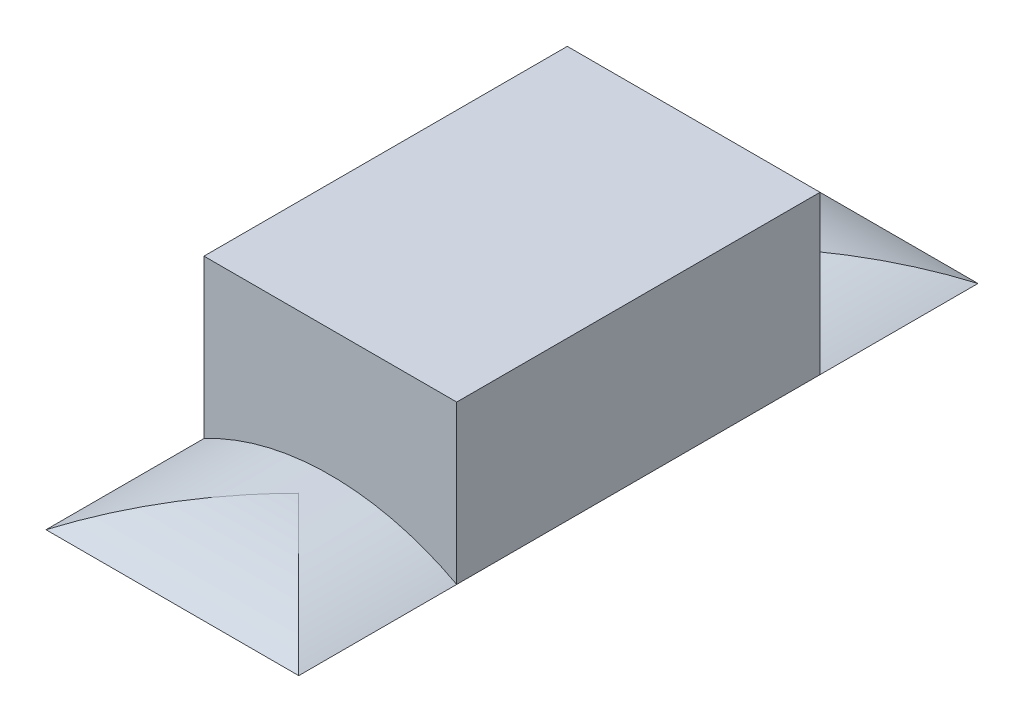
ISO-10303-21;
HEADER;
FILE_DESCRIPTION(('STEP AP214'),'2;1');
FILE_NAME('part.step','',(''),(''),'','','');
FILE_SCHEMA(('AUTOMOTIVE_DESIGN { 1 0 10303 214 1 1 1 1 }'));
ENDSEC;
DATA;
#1=APPLICATION_CONTEXT('core data for automotive mechanical design processes');
#2=APPLICATION_PROTOCOL_DEFINITION('international standard','automotive_design',2000,#1);
#3=PRODUCT_CONTEXT('',#1,'mechanical');
#4=PRODUCT('Part','Part','',(#3));
#5=PRODUCT_RELATED_PRODUCT_CATEGORY('part','',(#4));
#6=PRODUCT_DEFINITION_FORMATION('','',#4);
#7=PRODUCT_DEFINITION_CONTEXT('part definition',#1,'design');
#8=PRODUCT_DEFINITION('design','',#6,#7);
#9=PRODUCT_DEFINITION_SHAPE('','',#8);
#10=(LENGTH_UNIT() NAMED_UNIT(*) SI_UNIT(.MILLI.,.METRE.));
#11=(NAMED_UNIT(*) PLANE_ANGLE_UNIT() SI_UNIT($,.RADIAN.));
#12=(NAMED_UNIT(*) SI_UNIT($,.STERADIAN.) SOLID_ANGLE_UNIT());
#13=UNCERTAINTY_MEASURE_WITH_UNIT(LENGTH_MEASURE(1.E-05),#10,'distance_accuracy_value','');
#14=(GEOMETRIC_REPRESENTATION_CONTEXT(3) GLOBAL_UNCERTAINTY_ASSIGNED_CONTEXT((#13)) GLOBAL_UNIT_ASSIGNED_CONTEXT((#10,
#11,#12)) REPRESENTATION_CONTEXT('',''));
#15=CARTESIAN_POINT('',(0.,0.,0.));
#16=DIRECTION('',(0.,0.,1.));
#17=DIRECTION('',(1.,0.,0.));
#18=AXIS2_PLACEMENT_3D('',#15,#16,#17);
#19=CARTESIAN_POINT('',(15.8,0.,33.85));
#20=DIRECTION('',(0.,1.,0.));
#21=DIRECTION('',(0.,0.,1.));
#22=AXIS2_PLACEMENT_3D('',#19,#20,#21);
#23=PLANE('',#22);
#24=DIRECTION('',(1.,0.,0.));
#25=VECTOR('',#24,1.);
#26=CARTESIAN_POINT('',(15.8,0.,35.));
#27=LINE('',#26,#25);
#28=CARTESIAN_POINT('',(15.,0.,35.));
#29=VERTEX_POINT('',#28);
#30=CARTESIAN_POINT('',(16.6,0.,35.));
#31=VERTEX_POINT('',#30);
#32=EDGE_CURVE('P0_E19',#29,#31,#27,.T.);
#33=ORIENTED_EDGE('',*,*,#32,.F.);
#34=DIRECTION('',(0.,0.,1.));
#35=VECTOR('',#34,1.);
#36=CARTESIAN_POINT('',(15.,0.,32.7));
#37=LINE('',#36,#35);
#38=CARTESIAN_POINT('',(15.,0.,32.7));
#39=VERTEX_POINT('',#38);
#40=EDGE_CURVE('P0_E54',#39,#29,#37,.T.);
#41=ORIENTED_EDGE('',*,*,#40,.F.);
#42=DIRECTION('',(-1.,0.,0.));
#43=VECTOR('',#42,1.);
#44=CARTESIAN_POINT('',(16.6,0.,32.7));
#45=LINE('',#44,#43);
#46=CARTESIAN_POINT('',(16.6,0.,32.7));
#47=VERTEX_POINT('',#46);
#48=EDGE_CURVE('P0_E57',#47,#39,#45,.T.);
#49=ORIENTED_EDGE('',*,*,#48,.F.);
#50=DIRECTION('',(0.,0.,-1.));
#51=VECTOR('',#50,1.);
#52=CARTESIAN_POINT('',(16.6,0.,35.));
#53=LINE('',#52,#51);
#54=EDGE_CURVE('P0_E59',#31,#47,#53,.T.);
#55=ORIENTED_EDGE('',*,*,#54,.F.);
#56=EDGE_LOOP('',(#33,#41,#49,#55));
#57=FACE_BOUND('',#56,.T.);
#58=ADVANCED_FACE('P0_F16',(#57),#23,.F.);
#59=CARTESIAN_POINT('',(16.6,0.,35.));
#60=DIRECTION('',(1.,0.,0.));
#61=DIRECTION('',(0.,0.,-1.));
#62=AXIS2_PLACEMENT_3D('',#59,#60,#61);
#63=PLANE('',#62);
#64=DIRECTION('',(0.,0.,1.));
#65=VECTOR('',#64,1.);
#66=CARTESIAN_POINT('',(16.6,1.,33.85));
#67=LINE('',#66,#65);
#68=CARTESIAN_POINT('',(16.6,1.,35.));
#69=VERTEX_POINT('',#68);
#70=CARTESIAN_POINT('',(16.6,1.,32.7));
#71=VERTEX_POINT('',#70);
#72=EDGE_CURVE('P0_E82',#69,#71,#67,.F.);
#73=ORIENTED_EDGE('',*,*,#72,.F.);
#74=DIRECTION('',(0.,1.,0.));
#75=VECTOR('',#74,1.);
#76=CARTESIAN_POINT('',(16.6,0.,35.));
#77=LINE('',#76,#75);
#78=EDGE_CURVE('P0_E70',#31,#69,#77,.T.);
#79=ORIENTED_EDGE('',*,*,#78,.F.);
#80=ORIENTED_EDGE('',*,*,#54,.T.);
#81=DIRECTION('',(0.,1.,0.));
#82=VECTOR('',#81,1.);
#83=CARTESIAN_POINT('',(16.6,0.,32.7));
#84=LINE('',#83,#82);
#85=EDGE_CURVE('P0_E64',#71,#47,#84,.F.);
#86=ORIENTED_EDGE('',*,*,#85,.F.);
#87=EDGE_LOOP('',(#73,#79,#80,#86));
#88=FACE_BOUND('',#87,.T.);
#89=ADVANCED_FACE('P0_F67',(#88),#63,.T.);
#90=CARTESIAN_POINT('',(16.6,0.,32.7));
#91=DIRECTION('',(0.,0.,-1.));
#92=DIRECTION('',(-1.,0.,0.));
#93=AXIS2_PLACEMENT_3D('',#90,#91,#92);
#94=PLANE('',#93);
#95=DIRECTION('',(1.,0.,0.));
#96=VECTOR('',#95,1.);
#97=CARTESIAN_POINT('',(15.8,1.,32.7));
#98=LINE('',#97,#96);
#99=CARTESIAN_POINT('',(15.,1.,32.7));
#100=VERTEX_POINT('',#99);
#101=EDGE_CURVE('P0_E73',#71,#100,#98,.F.);
#102=ORIENTED_EDGE('',*,*,#101,.F.);
#103=ORIENTED_EDGE('',*,*,#85,.T.);
#104=ORIENTED_EDGE('',*,*,#48,.T.);
#105=DIRECTION('',(0.,1.,0.));
#106=VECTOR('',#105,1.);
#107=CARTESIAN_POINT('',(15.,0.,32.7));
#108=LINE('',#107,#106);
#109=EDGE_CURVE('P0_E76',#100,#39,#108,.F.);
#110=ORIENTED_EDGE('',*,*,#109,.F.);
#111=EDGE_LOOP('',(#102,#103,#104,#110));
#112=FACE_BOUND('',#111,.T.);
#113=ADVANCED_FACE('P0_F71',(#112),#94,.T.);
#114=CARTESIAN_POINT('',(15.,0.,32.7));
#115=DIRECTION('',(-1.,0.,0.));
#116=DIRECTION('',(0.,0.,1.));
#117=AXIS2_PLACEMENT_3D('',#114,#115,#116);
#118=PLANE('',#117);
#119=DIRECTION('',(0.,0.,1.));
#120=VECTOR('',#119,1.);
#121=CARTESIAN_POINT('',(15.,1.,33.85));
#122=LINE('',#121,#120);
#123=CARTESIAN_POINT('',(15.,1.,35.));
#124=VERTEX_POINT('',#123);
#125=EDGE_CURVE('P0_E25',#100,#124,#122,.T.);
#126=ORIENTED_EDGE('',*,*,#125,.F.);
#127=ORIENTED_EDGE('',*,*,#109,.T.);
#128=ORIENTED_EDGE('',*,*,#40,.T.);
#129=DIRECTION('',(0.,1.,0.));
#130=VECTOR('',#129,1.);
#131=CARTESIAN_POINT('',(15.,0.,35.));
#132=LINE('',#131,#130);
#133=EDGE_CURVE('P0_E34',#124,#29,#132,.F.);
#134=ORIENTED_EDGE('',*,*,#133,.F.);
#135=EDGE_LOOP('',(#126,#127,#128,#134));
#136=FACE_BOUND('',#135,.T.);
#137=ADVANCED_FACE('P0_F88',(#136),#118,.T.);
#138=CARTESIAN_POINT('',(15.,0.,35.));
#139=DIRECTION('',(0.,0.,1.));
#140=DIRECTION('',(1.,0.,0.));
#141=AXIS2_PLACEMENT_3D('',#138,#139,#140);
#142=PLANE('',#141);
#143=DIRECTION('',(1.,0.,0.));
#144=VECTOR('',#143,1.);
#145=CARTESIAN_POINT('',(15.8,1.,35.));
#146=LINE('',#145,#144);
#147=EDGE_CURVE('P0_E11',#124,#69,#146,.T.);
#148=ORIENTED_EDGE('',*,*,#147,.F.);
#149=ORIENTED_EDGE('',*,*,#133,.T.);
#150=ORIENTED_EDGE('',*,*,#32,.T.);
#151=ORIENTED_EDGE('',*,*,#78,.T.);
#152=EDGE_LOOP('',(#148,#149,#150,#151));
#153=FACE_BOUND('',#152,.T.);
#154=ADVANCED_FACE('P0_F90',(#153),#142,.T.);
#155=CARTESIAN_POINT('',(15.8,1.,33.85));
#156=DIRECTION('',(0.,1.,0.));
#157=DIRECTION('',(0.,0.,1.));
#158=AXIS2_PLACEMENT_3D('',#155,#156,#157);
#159=PLANE('',#158);
#160=ORIENTED_EDGE('',*,*,#125,.T.);
#161=ORIENTED_EDGE('',*,*,#147,.T.);
#162=ORIENTED_EDGE('',*,*,#72,.T.);
#163=ORIENTED_EDGE('',*,*,#101,.T.);
#164=EDGE_LOOP('',(#160,#161,#162,#163));
#165=FACE_BOUND('',#164,.T.);
#166=ADVANCED_FACE('P0_F87',(#165),#159,.T.);
#167=CLOSED_SHELL('',(#58,#89,#113,#137,#154,#166));
#168=MANIFOLD_SOLID_BREP('P0_B1',#167);
#169=CARTESIAN_POINT('',(15.,-1.5,32.5));
#170=DIRECTION('',(1.,0.,0.));
#171=DIRECTION('',(0.,0.,-1.));
#172=AXIS2_PLACEMENT_3D('',#169,#170,#171);
#173=CYLINDRICAL_SURFACE('',#172,1.7);
#174=CARTESIAN_POINT('',(15.8,-1.5,32.5));
#175=DIRECTION('',(0.707106781186547,0.,0.707106781186547));
#176=DIRECTION('',(-0.707106781186547,0.,0.707106781186547));
#177=AXIS2_PLACEMENT_3D('',#174,#175,#176);
#178=ELLIPSE('',#177,2.40416305603426,1.7);
#179=CARTESIAN_POINT('',(16.6,0.,31.7));
#180=VERTEX_POINT('',#179);
#181=CARTESIAN_POINT('',(15.8,0.2,32.5));
#182=VERTEX_POINT('',#181);
#183=EDGE_CURVE('P1_E19',#180,#182,#178,.T.);
#184=ORIENTED_EDGE('',*,*,#183,.F.);
#185=DIRECTION('',(1.,0.,0.));
#186=VECTOR('',#185,1.);
#187=CARTESIAN_POINT('',(15.8,0.,31.7));
#188=LINE('',#187,#186);
#189=CARTESIAN_POINT('',(15.,0.,31.7));
#190=VERTEX_POINT('',#189);
#191=EDGE_CURVE('P1_E44',#180,#190,#188,.F.);
#192=ORIENTED_EDGE('',*,*,#191,.T.);
#193=CARTESIAN_POINT('',(15.8,-1.5,32.5));
#194=DIRECTION('',(-0.707106781186547,0.,0.707106781186547));
#195=DIRECTION('',(0.707106781186547,0.,0.707106781186547));
#196=AXIS2_PLACEMENT_3D('',#193,#194,#195);
#197=ELLIPSE('',#196,2.40416305603426,1.7);
#198=EDGE_CURVE('P1_E49',#182,#190,#197,.T.);
#199=ORIENTED_EDGE('',*,*,#198,.F.);
#200=EDGE_LOOP('',(#184,#192,#199));
#201=FACE_BOUND('',#200,.T.);
#202=ADVANCED_FACE('P1_F16',(#201),#173,.T.);
#203=CARTESIAN_POINT('',(15.,0.,32.7));
#204=DIRECTION('',(0.,0.,1.));
#205=DIRECTION('',(1.,0.,0.));
#206=AXIS2_PLACEMENT_3D('',#203,#204,#205);
#207=PLANE('',#206);
#208=CARTESIAN_POINT('',(15.8,-1.5,32.7));
#209=DIRECTION('',(0.,0.,1.));
#210=DIRECTION('',(1.,0.,0.));
#211=AXIS2_PLACEMENT_3D('',#208,#209,#210);
#212=CIRCLE('',#211,1.7);
#213=CARTESIAN_POINT('',(15.,0.,32.7));
#214=VERTEX_POINT('',#213);
#215=CARTESIAN_POINT('',(16.6,0.,32.7));
#216=VERTEX_POINT('',#215);
#217=EDGE_CURVE('P1_E33',#214,#216,#212,.F.);
#218=ORIENTED_EDGE('',*,*,#217,.F.);
#219=DIRECTION('',(1.,0.,0.));
#220=VECTOR('',#219,1.);
#221=CARTESIAN_POINT('',(15.8,0.,32.7));
#222=LINE('',#221,#220);
#223=EDGE_CURVE('P1_E25',#214,#216,#222,.T.);
#224=ORIENTED_EDGE('',*,*,#223,.T.);
#225=EDGE_LOOP('',(#218,#224));
#226=FACE_BOUND('',#225,.T.);
#227=ADVANCED_FACE('P1_F59',(#226),#207,.T.);
#228=CARTESIAN_POINT('',(15.8,-1.5,31.7));
#229=DIRECTION('',(0.,0.,1.));
#230=DIRECTION('',(1.,0.,0.));
#231=AXIS2_PLACEMENT_3D('',#228,#229,#230);
#232=CYLINDRICAL_SURFACE('',#231,1.7);
#233=ORIENTED_EDGE('',*,*,#217,.T.);
#234=DIRECTION('',(0.,0.,1.));
#235=VECTOR('',#234,1.);
#236=CARTESIAN_POINT('',(16.6,0.,33.85));
#237=LINE('',#236,#235);
#238=EDGE_CURVE('P1_E11',#216,#180,#237,.F.);
#239=ORIENTED_EDGE('',*,*,#238,.T.);
#240=ORIENTED_EDGE('',*,*,#183,.T.);
#241=ORIENTED_EDGE('',*,*,#198,.T.);
#242=DIRECTION('',(0.,0.,1.));
#243=VECTOR('',#242,1.);
#244=CARTESIAN_POINT('',(15.,0.,33.85));
#245=LINE('',#244,#243);
#246=EDGE_CURVE('P1_E53',#190,#214,#245,.T.);
#247=ORIENTED_EDGE('',*,*,#246,.T.);
#248=EDGE_LOOP('',(#233,#239,#240,#241,#247));
#249=FACE_BOUND('',#248,.T.);
#250=ADVANCED_FACE('P1_F48',(#249),#232,.T.);
#251=CARTESIAN_POINT('',(15.8,0.,33.85));
#252=DIRECTION('',(0.,1.,0.));
#253=DIRECTION('',(0.,0.,1.));
#254=AXIS2_PLACEMENT_3D('',#251,#252,#253);
#255=PLANE('',#254);
#256=ORIENTED_EDGE('',*,*,#223,.F.);
#257=ORIENTED_EDGE('',*,*,#246,.F.);
#258=ORIENTED_EDGE('',*,*,#191,.F.);
#259=ORIENTED_EDGE('',*,*,#238,.F.);
#260=EDGE_LOOP('',(#256,#257,#258,#259));
#261=FACE_BOUND('',#260,.T.);
#262=ADVANCED_FACE('P1_F60',(#261),#255,.F.);
#263=CLOSED_SHELL('',(#202,#227,#250,#262));
#264=MANIFOLD_SOLID_BREP('P1_B1',#263);
#265=CARTESIAN_POINT('',(16.6,-1.5,35.2));
#266=DIRECTION('',(-1.,0.,0.));
#267=DIRECTION('',(0.,0.,1.));
#268=AXIS2_PLACEMENT_3D('',#265,#266,#267);
#269=CYLINDRICAL_SURFACE('',#268,1.7);
#270=CARTESIAN_POINT('',(15.8,-1.5,35.2));
#271=DIRECTION('',(-0.707106781186547,0.,-0.707106781186547));
#272=DIRECTION('',(0.707106781186547,0.,-0.707106781186547));
#273=AXIS2_PLACEMENT_3D('',#270,#271,#272);
#274=ELLIPSE('',#273,2.40416305603426,1.7);
#275=CARTESIAN_POINT('',(15.,0.,36.));
#276=VERTEX_POINT('',#275);
#277=CARTESIAN_POINT('',(15.8,0.2,35.2));
#278=VERTEX_POINT('',#277);
#279=EDGE_CURVE('P2_E19',#276,#278,#274,.T.);
#280=ORIENTED_EDGE('',*,*,#279,.F.);
#281=DIRECTION('',(1.,0.,0.));
#282=VECTOR('',#281,1.);
#283=CARTESIAN_POINT('',(15.8,0.,36.));
#284=LINE('',#283,#282);
#285=CARTESIAN_POINT('',(16.6,0.,36.));
#286=VERTEX_POINT('',#285);
#287=EDGE_CURVE('P2_E54',#276,#286,#284,.T.);
#288=ORIENTED_EDGE('',*,*,#287,.T.);
#289=CARTESIAN_POINT('',(15.8,-1.5,35.2));
#290=DIRECTION('',(0.707106781186547,0.,-0.707106781186547));
#291=DIRECTION('',(-0.707106781186547,0.,-0.707106781186547));
#292=AXIS2_PLACEMENT_3D('',#289,#290,#291);
#293=ELLIPSE('',#292,2.40416305603426,1.7);
#294=EDGE_CURVE('P2_E52',#278,#286,#293,.T.);
#295=ORIENTED_EDGE('',*,*,#294,.F.);
#296=EDGE_LOOP('',(#280,#288,#295));
#297=FACE_BOUND('',#296,.T.);
#298=ADVANCED_FACE('P2_F16',(#297),#269,.T.);
#299=CARTESIAN_POINT('',(15.8,-1.5,36.));
#300=DIRECTION('',(0.,0.,-1.));
#301=DIRECTION('',(-1.,0.,0.));
#302=AXIS2_PLACEMENT_3D('',#299,#300,#301);
#303=CYLINDRICAL_SURFACE('',#302,1.7);
#304=CARTESIAN_POINT('',(15.8,-1.5,35.));
#305=DIRECTION('',(0.,0.,-1.));
#306=DIRECTION('',(-1.,0.,0.));
#307=AXIS2_PLACEMENT_3D('',#304,#305,#306);
#308=CIRCLE('',#307,1.7);
#309=CARTESIAN_POINT('',(15.,0.,35.));
#310=VERTEX_POINT('',#309);
#311=CARTESIAN_POINT('',(16.6,0.,35.));
#312=VERTEX_POINT('',#311);
#313=EDGE_CURVE('P2_E32',#310,#312,#308,.T.);
#314=ORIENTED_EDGE('',*,*,#313,.F.);
#315=DIRECTION('',(0.,0.,1.));
#316=VECTOR('',#315,1.);
#317=CARTESIAN_POINT('',(15.,0.,33.85));
#318=LINE('',#317,#316);
#319=EDGE_CURVE('P2_E48',#310,#276,#318,.T.);
#320=ORIENTED_EDGE('',*,*,#319,.T.);
#321=ORIENTED_EDGE('',*,*,#279,.T.);
#322=ORIENTED_EDGE('',*,*,#294,.T.);
#323=DIRECTION('',(0.,0.,1.));
#324=VECTOR('',#323,1.);
#325=CARTESIAN_POINT('',(16.6,0.,33.85));
#326=LINE('',#325,#324);
#327=EDGE_CURVE('P2_E25',#286,#312,#326,.F.);
#328=ORIENTED_EDGE('',*,*,#327,.T.);
#329=EDGE_LOOP('',(#314,#320,#321,#322,#328));
#330=FACE_BOUND('',#329,.T.);
#331=ADVANCED_FACE('P2_F50',(#330),#303,.T.);
#332=CARTESIAN_POINT('',(16.6,0.,35.));
#333=DIRECTION('',(0.,0.,-1.));
#334=DIRECTION('',(-1.,0.,0.));
#335=AXIS2_PLACEMENT_3D('',#332,#333,#334);
#336=PLANE('',#335);
#337=ORIENTED_EDGE('',*,*,#313,.T.);
#338=DIRECTION('',(1.,0.,0.));
#339=VECTOR('',#338,1.);
#340=CARTESIAN_POINT('',(15.8,0.,35.));
#341=LINE('',#340,#339);
#342=EDGE_CURVE('P2_E11',#312,#310,#341,.F.);
#343=ORIENTED_EDGE('',*,*,#342,.T.);
#344=EDGE_LOOP('',(#337,#343));
#345=FACE_BOUND('',#344,.T.);
#346=ADVANCED_FACE('P2_F60',(#345),#336,.T.);
#347=CARTESIAN_POINT('',(15.8,0.,33.85));
#348=DIRECTION('',(0.,1.,0.));
#349=DIRECTION('',(0.,0.,1.));
#350=AXIS2_PLACEMENT_3D('',#347,#348,#349);
#351=PLANE('',#350);
#352=ORIENTED_EDGE('',*,*,#327,.F.);
#353=ORIENTED_EDGE('',*,*,#287,.F.);
#354=ORIENTED_EDGE('',*,*,#319,.F.);
#355=ORIENTED_EDGE('',*,*,#342,.F.);
#356=EDGE_LOOP('',(#352,#353,#354,#355));
#357=FACE_BOUND('',#356,.T.);
#358=ADVANCED_FACE('P2_F59',(#357),#351,.F.);
#359=CLOSED_SHELL('',(#298,#331,#346,#358));
#360=MANIFOLD_SOLID_BREP('P2_B1',#359);
#361=ADVANCED_BREP_SHAPE_REPRESENTATION('',(#18,#168,#264,#360),#14);
#362=SHAPE_DEFINITION_REPRESENTATION(#9,#361);
ENDSEC;
END-ISO-10303-21;
